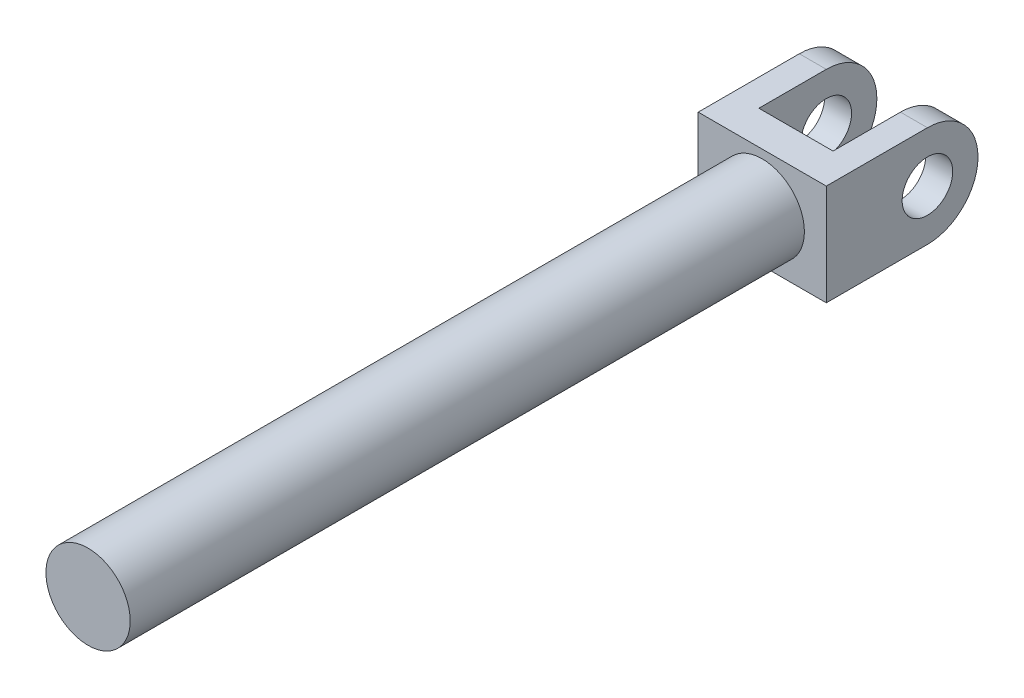
ISO-10303-21;
HEADER;
FILE_DESCRIPTION(('STEP AP214'),'2;1');
FILE_NAME('part.step','',(''),(''),'','','');
FILE_SCHEMA(('AUTOMOTIVE_DESIGN { 1 0 10303 214 1 1 1 1 }'));
ENDSEC;
DATA;
#1=APPLICATION_CONTEXT('core data for automotive mechanical design processes');
#2=APPLICATION_PROTOCOL_DEFINITION('international standard','automotive_design',2000,#1);
#3=PRODUCT_CONTEXT('',#1,'mechanical');
#4=PRODUCT('Part','Part','',(#3));
#5=PRODUCT_RELATED_PRODUCT_CATEGORY('part','',(#4));
#6=PRODUCT_DEFINITION_FORMATION('','',#4);
#7=PRODUCT_DEFINITION_CONTEXT('part definition',#1,'design');
#8=PRODUCT_DEFINITION('design','',#6,#7);
#9=PRODUCT_DEFINITION_SHAPE('','',#8);
#10=(LENGTH_UNIT() NAMED_UNIT(*) SI_UNIT(.MILLI.,.METRE.));
#11=(NAMED_UNIT(*) PLANE_ANGLE_UNIT() SI_UNIT($,.RADIAN.));
#12=(NAMED_UNIT(*) SI_UNIT($,.STERADIAN.) SOLID_ANGLE_UNIT());
#13=UNCERTAINTY_MEASURE_WITH_UNIT(LENGTH_MEASURE(1.E-05),#10,'distance_accuracy_value','');
#14=(GEOMETRIC_REPRESENTATION_CONTEXT(3) GLOBAL_UNCERTAINTY_ASSIGNED_CONTEXT((#13)) GLOBAL_UNIT_ASSIGNED_CONTEXT((#10,
#11,#12)) REPRESENTATION_CONTEXT('',''));
#15=CARTESIAN_POINT('',(0.,0.,0.));
#16=DIRECTION('',(0.,0.,1.));
#17=DIRECTION('',(1.,0.,0.));
#18=AXIS2_PLACEMENT_3D('',#15,#16,#17);
#19=CARTESIAN_POINT('',(19.,0.,0.));
#20=DIRECTION('',(-1.,0.,0.));
#21=DIRECTION('',(0.,0.,1.));
#22=AXIS2_PLACEMENT_3D('',#19,#20,#21);
#23=CYLINDRICAL_SURFACE('',#22,15.);
#24=DIRECTION('',(-1.,0.,0.));
#25=VECTOR('',#24,1.);
#26=CARTESIAN_POINT('',(19.,15.,0.));
#27=LINE('',#26,#25);
#28=CARTESIAN_POINT('',(-11.,15.,0.));
#29=VERTEX_POINT('',#28);
#30=CARTESIAN_POINT('',(-19.,15.,0.));
#31=VERTEX_POINT('',#30);
#32=EDGE_CURVE('E175',#29,#31,#27,.T.);
#33=ORIENTED_EDGE('',*,*,#32,.F.);
#34=CARTESIAN_POINT('',(-11.,0.,0.));
#35=DIRECTION('',(-1.,0.,0.));
#36=DIRECTION('',(0.,0.,1.));
#37=AXIS2_PLACEMENT_3D('',#34,#35,#36);
#38=CIRCLE('',#37,15.);
#39=CARTESIAN_POINT('',(-11.,-15.,0.));
#40=VERTEX_POINT('',#39);
#41=EDGE_CURVE('E144',#29,#40,#38,.T.);
#42=ORIENTED_EDGE('',*,*,#41,.T.);
#43=DIRECTION('',(-1.,0.,0.));
#44=VECTOR('',#43,1.);
#45=CARTESIAN_POINT('',(19.,-15.,0.));
#46=LINE('',#45,#44);
#47=CARTESIAN_POINT('',(-19.,-15.,0.));
#48=VERTEX_POINT('',#47);
#49=EDGE_CURVE('E82',#40,#48,#46,.T.);
#50=ORIENTED_EDGE('',*,*,#49,.T.);
#51=CARTESIAN_POINT('',(-19.,0.,0.));
#52=DIRECTION('',(1.,0.,0.));
#53=DIRECTION('',(0.,0.,-1.));
#54=AXIS2_PLACEMENT_3D('',#51,#52,#53);
#55=CIRCLE('',#54,15.);
#56=EDGE_CURVE('E150',#48,#31,#55,.T.);
#57=ORIENTED_EDGE('',*,*,#56,.T.);
#58=EDGE_LOOP('',(#33,#42,#50,#57));
#59=FACE_BOUND('',#58,.T.);
#60=ADVANCED_FACE('F34',(#59),#23,.T.);
#61=CARTESIAN_POINT('',(19.,0.,0.));
#62=DIRECTION('',(-1.,0.,0.));
#63=DIRECTION('',(0.,0.,1.));
#64=AXIS2_PLACEMENT_3D('',#61,#62,#63);
#65=CYLINDRICAL_SURFACE('',#64,7.5);
#66=CARTESIAN_POINT('',(-11.,0.,0.));
#67=DIRECTION('',(-1.,0.,0.));
#68=DIRECTION('',(0.,0.,1.));
#69=AXIS2_PLACEMENT_3D('',#66,#67,#68);
#70=CIRCLE('',#69,7.5);
#71=CARTESIAN_POINT('',(-11.,0.,7.5));
#72=VERTEX_POINT('',#71);
#73=EDGE_CURVE('E38',#72,#72,#70,.T.);
#74=ORIENTED_EDGE('',*,*,#73,.F.);
#75=EDGE_LOOP('',(#74));
#76=FACE_BOUND('',#75,.T.);
#77=CARTESIAN_POINT('',(-19.,0.,0.));
#78=DIRECTION('',(1.,0.,0.));
#79=DIRECTION('',(0.,0.,-1.));
#80=AXIS2_PLACEMENT_3D('',#77,#78,#79);
#81=CIRCLE('',#80,7.5);
#82=CARTESIAN_POINT('',(-19.,0.,-7.5));
#83=VERTEX_POINT('',#82);
#84=EDGE_CURVE('E146',#83,#83,#81,.T.);
#85=ORIENTED_EDGE('',*,*,#84,.F.);
#86=EDGE_LOOP('',(#85));
#87=FACE_BOUND('',#86,.T.);
#88=ADVANCED_FACE('F185',(#76,#87),#65,.F.);
#89=CARTESIAN_POINT('',(19.,0.,0.));
#90=DIRECTION('',(1.,0.,0.));
#91=DIRECTION('',(0.,0.,-1.));
#92=AXIS2_PLACEMENT_3D('',#89,#90,#91);
#93=PLANE('',#92);
#94=CARTESIAN_POINT('',(19.,0.,0.));
#95=DIRECTION('',(1.,0.,0.));
#96=DIRECTION('',(0.,0.,-1.));
#97=AXIS2_PLACEMENT_3D('',#94,#95,#96);
#98=CIRCLE('',#97,15.);
#99=CARTESIAN_POINT('',(19.,-15.,0.));
#100=VERTEX_POINT('',#99);
#101=CARTESIAN_POINT('',(19.,15.,0.));
#102=VERTEX_POINT('',#101);
#103=EDGE_CURVE('E153',#100,#102,#98,.T.);
#104=ORIENTED_EDGE('',*,*,#103,.T.);
#105=DIRECTION('',(0.,0.,1.));
#106=VECTOR('',#105,1.);
#107=CARTESIAN_POINT('',(19.,15.,30.));
#108=LINE('',#107,#106);
#109=CARTESIAN_POINT('',(19.,15.,30.));
#110=VERTEX_POINT('',#109);
#111=EDGE_CURVE('E90',#102,#110,#108,.T.);
#112=ORIENTED_EDGE('',*,*,#111,.T.);
#113=DIRECTION('',(0.,-1.,0.));
#114=VECTOR('',#113,1.);
#115=CARTESIAN_POINT('',(19.,-15.,30.));
#116=LINE('',#115,#114);
#117=CARTESIAN_POINT('',(19.,-15.,30.));
#118=VERTEX_POINT('',#117);
#119=EDGE_CURVE('E157',#110,#118,#116,.T.);
#120=ORIENTED_EDGE('',*,*,#119,.T.);
#121=DIRECTION('',(0.,0.,-1.));
#122=VECTOR('',#121,1.);
#123=CARTESIAN_POINT('',(19.,-15.,0.));
#124=LINE('',#123,#122);
#125=EDGE_CURVE('E60',#118,#100,#124,.T.);
#126=ORIENTED_EDGE('',*,*,#125,.T.);
#127=EDGE_LOOP('',(#104,#112,#120,#126));
#128=FACE_BOUND('',#127,.T.);
#129=CARTESIAN_POINT('',(19.,0.,0.));
#130=DIRECTION('',(1.,0.,0.));
#131=DIRECTION('',(0.,0.,-1.));
#132=AXIS2_PLACEMENT_3D('',#129,#130,#131);
#133=CIRCLE('',#132,7.5);
#134=CARTESIAN_POINT('',(19.,0.,-7.5));
#135=VERTEX_POINT('',#134);
#136=EDGE_CURVE('E147',#135,#135,#133,.T.);
#137=ORIENTED_EDGE('',*,*,#136,.F.);
#138=EDGE_LOOP('',(#137));
#139=FACE_BOUND('',#138,.T.);
#140=ADVANCED_FACE('F188',(#128,#139),#93,.T.);
#141=CARTESIAN_POINT('',(-19.,0.,0.));
#142=DIRECTION('',(1.,0.,0.));
#143=DIRECTION('',(0.,0.,-1.));
#144=AXIS2_PLACEMENT_3D('',#141,#142,#143);
#145=PLANE('',#144);
#146=ORIENTED_EDGE('',*,*,#56,.F.);
#147=DIRECTION('',(0.,0.,-1.));
#148=VECTOR('',#147,1.);
#149=CARTESIAN_POINT('',(-19.,-15.,0.));
#150=LINE('',#149,#148);
#151=CARTESIAN_POINT('',(-19.,-15.,30.));
#152=VERTEX_POINT('',#151);
#153=EDGE_CURVE('E155',#152,#48,#150,.T.);
#154=ORIENTED_EDGE('',*,*,#153,.F.);
#155=DIRECTION('',(0.,-1.,0.));
#156=VECTOR('',#155,1.);
#157=CARTESIAN_POINT('',(-19.,-15.,30.));
#158=LINE('',#157,#156);
#159=CARTESIAN_POINT('',(-19.,15.,30.));
#160=VERTEX_POINT('',#159);
#161=EDGE_CURVE('E163',#160,#152,#158,.T.);
#162=ORIENTED_EDGE('',*,*,#161,.F.);
#163=DIRECTION('',(0.,0.,1.));
#164=VECTOR('',#163,1.);
#165=CARTESIAN_POINT('',(-19.,15.,30.));
#166=LINE('',#165,#164);
#167=EDGE_CURVE('E161',#31,#160,#166,.T.);
#168=ORIENTED_EDGE('',*,*,#167,.F.);
#169=EDGE_LOOP('',(#146,#154,#162,#168));
#170=FACE_BOUND('',#169,.T.);
#171=ORIENTED_EDGE('',*,*,#84,.T.);
#172=EDGE_LOOP('',(#171));
#173=FACE_BOUND('',#172,.T.);
#174=ADVANCED_FACE('F190',(#170,#173),#145,.F.);
#175=CARTESIAN_POINT('',(11.,0.,0.));
#176=DIRECTION('',(1.,0.,0.));
#177=DIRECTION('',(0.,0.,-1.));
#178=AXIS2_PLACEMENT_3D('',#175,#176,#177);
#179=CIRCLE('',#178,15.);
#180=CARTESIAN_POINT('',(11.,-15.,0.));
#181=VERTEX_POINT('',#180);
#182=CARTESIAN_POINT('',(11.,15.,0.));
#183=VERTEX_POINT('',#182);
#184=EDGE_CURVE('E142',#181,#183,#179,.T.);
#185=ORIENTED_EDGE('',*,*,#184,.T.);
#186=EDGE_CURVE('E43',#102,#183,#27,.T.);
#187=ORIENTED_EDGE('',*,*,#186,.F.);
#188=ORIENTED_EDGE('',*,*,#103,.F.);
#189=EDGE_CURVE('E166',#100,#181,#46,.T.);
#190=ORIENTED_EDGE('',*,*,#189,.T.);
#191=EDGE_LOOP('',(#185,#187,#188,#190));
#192=FACE_BOUND('',#191,.T.);
#193=ADVANCED_FACE('F36',(#192),#23,.T.);
#194=CARTESIAN_POINT('',(19.,15.,30.));
#195=DIRECTION('',(0.,-1.,0.));
#196=DIRECTION('',(0.,0.,-1.));
#197=AXIS2_PLACEMENT_3D('',#194,#195,#196);
#198=PLANE('',#197);
#199=DIRECTION('',(1.,0.,0.));
#200=VECTOR('',#199,1.);
#201=CARTESIAN_POINT('',(-11.,15.,20.));
#202=LINE('',#201,#200);
#203=CARTESIAN_POINT('',(-11.,15.,20.));
#204=VERTEX_POINT('',#203);
#205=CARTESIAN_POINT('',(11.,15.,20.));
#206=VERTEX_POINT('',#205);
#207=EDGE_CURVE('E132',#204,#206,#202,.T.);
#208=ORIENTED_EDGE('',*,*,#207,.F.);
#209=DIRECTION('',(0.,0.,1.));
#210=VECTOR('',#209,1.);
#211=CARTESIAN_POINT('',(-11.,15.,-15.));
#212=LINE('',#211,#210);
#213=EDGE_CURVE('E117',#29,#204,#212,.T.);
#214=ORIENTED_EDGE('',*,*,#213,.F.);
#215=ORIENTED_EDGE('',*,*,#32,.T.);
#216=ORIENTED_EDGE('',*,*,#167,.T.);
#217=DIRECTION('',(-1.,0.,0.));
#218=VECTOR('',#217,1.);
#219=CARTESIAN_POINT('',(19.,15.,30.));
#220=LINE('',#219,#218);
#221=EDGE_CURVE('E172',#110,#160,#220,.T.);
#222=ORIENTED_EDGE('',*,*,#221,.F.);
#223=ORIENTED_EDGE('',*,*,#111,.F.);
#224=ORIENTED_EDGE('',*,*,#186,.T.);
#225=DIRECTION('',(0.,0.,-1.));
#226=VECTOR('',#225,1.);
#227=CARTESIAN_POINT('',(11.,15.,-15.));
#228=LINE('',#227,#226);
#229=EDGE_CURVE('E129',#206,#183,#228,.T.);
#230=ORIENTED_EDGE('',*,*,#229,.F.);
#231=EDGE_LOOP('',(#208,#214,#215,#216,#222,#223,#224,#230));
#232=FACE_BOUND('',#231,.T.);
#233=ADVANCED_FACE('F204',(#232),#198,.F.);
#234=CARTESIAN_POINT('',(19.,-15.,30.));
#235=DIRECTION('',(0.,0.,-1.));
#236=DIRECTION('',(-1.,0.,0.));
#237=AXIS2_PLACEMENT_3D('',#234,#235,#236);
#238=PLANE('',#237);
#239=CARTESIAN_POINT('',(0.,0.,30.));
#240=DIRECTION('',(0.,0.,1.));
#241=DIRECTION('',(1.,0.,0.));
#242=AXIS2_PLACEMENT_3D('',#239,#240,#241);
#243=CIRCLE('',#242,12.5);
#244=CARTESIAN_POINT('',(12.5,0.,30.));
#245=VERTEX_POINT('',#244);
#246=EDGE_CURVE('E11',#245,#245,#243,.T.);
#247=ORIENTED_EDGE('',*,*,#246,.F.);
#248=EDGE_LOOP('',(#247));
#249=FACE_BOUND('',#248,.T.);
#250=ORIENTED_EDGE('',*,*,#161,.T.);
#251=DIRECTION('',(-1.,0.,0.));
#252=VECTOR('',#251,1.);
#253=CARTESIAN_POINT('',(19.,-15.,30.));
#254=LINE('',#253,#252);
#255=EDGE_CURVE('E169',#118,#152,#254,.T.);
#256=ORIENTED_EDGE('',*,*,#255,.F.);
#257=ORIENTED_EDGE('',*,*,#119,.F.);
#258=ORIENTED_EDGE('',*,*,#221,.T.);
#259=EDGE_LOOP('',(#250,#256,#257,#258));
#260=FACE_BOUND('',#259,.T.);
#261=ADVANCED_FACE('F209',(#249,#260),#238,.F.);
#262=CARTESIAN_POINT('',(19.,-15.,0.));
#263=DIRECTION('',(0.,1.,0.));
#264=DIRECTION('',(0.,0.,1.));
#265=AXIS2_PLACEMENT_3D('',#262,#263,#264);
#266=PLANE('',#265);
#267=ORIENTED_EDGE('',*,*,#49,.F.);
#268=DIRECTION('',(0.,0.,1.));
#269=VECTOR('',#268,1.);
#270=CARTESIAN_POINT('',(-11.,-15.,-15.));
#271=LINE('',#270,#269);
#272=CARTESIAN_POINT('',(-11.,-15.,20.));
#273=VERTEX_POINT('',#272);
#274=EDGE_CURVE('E115',#40,#273,#271,.T.);
#275=ORIENTED_EDGE('',*,*,#274,.T.);
#276=DIRECTION('',(1.,0.,0.));
#277=VECTOR('',#276,1.);
#278=CARTESIAN_POINT('',(-11.,-15.,20.));
#279=LINE('',#278,#277);
#280=CARTESIAN_POINT('',(11.,-15.,20.));
#281=VERTEX_POINT('',#280);
#282=EDGE_CURVE('E124',#273,#281,#279,.T.);
#283=ORIENTED_EDGE('',*,*,#282,.T.);
#284=DIRECTION('',(0.,0.,-1.));
#285=VECTOR('',#284,1.);
#286=CARTESIAN_POINT('',(11.,-15.,-15.));
#287=LINE('',#286,#285);
#288=EDGE_CURVE('E51',#281,#181,#287,.T.);
#289=ORIENTED_EDGE('',*,*,#288,.T.);
#290=ORIENTED_EDGE('',*,*,#189,.F.);
#291=ORIENTED_EDGE('',*,*,#125,.F.);
#292=ORIENTED_EDGE('',*,*,#255,.T.);
#293=ORIENTED_EDGE('',*,*,#153,.T.);
#294=EDGE_LOOP('',(#267,#275,#283,#289,#290,#291,#292,#293));
#295=FACE_BOUND('',#294,.T.);
#296=ADVANCED_FACE('F128',(#295),#266,.F.);
#297=CARTESIAN_POINT('',(11.,0.,0.));
#298=DIRECTION('',(1.,0.,0.));
#299=DIRECTION('',(0.,0.,-1.));
#300=AXIS2_PLACEMENT_3D('',#297,#298,#299);
#301=CIRCLE('',#300,7.5);
#302=CARTESIAN_POINT('',(11.,0.,-7.5));
#303=VERTEX_POINT('',#302);
#304=EDGE_CURVE('E140',#303,#303,#301,.T.);
#305=ORIENTED_EDGE('',*,*,#304,.F.);
#306=EDGE_LOOP('',(#305));
#307=FACE_BOUND('',#306,.T.);
#308=ORIENTED_EDGE('',*,*,#136,.T.);
#309=EDGE_LOOP('',(#308));
#310=FACE_BOUND('',#309,.T.);
#311=ADVANCED_FACE('F181',(#307,#310),#65,.F.);
#312=CARTESIAN_POINT('',(-11.,-15.,-15.));
#313=DIRECTION('',(-1.,0.,0.));
#314=DIRECTION('',(0.,0.,1.));
#315=AXIS2_PLACEMENT_3D('',#312,#313,#314);
#316=PLANE('',#315);
#317=ORIENTED_EDGE('',*,*,#73,.T.);
#318=EDGE_LOOP('',(#317));
#319=FACE_BOUND('',#318,.T.);
#320=ORIENTED_EDGE('',*,*,#213,.T.);
#321=DIRECTION('',(0.,1.,0.));
#322=VECTOR('',#321,1.);
#323=CARTESIAN_POINT('',(-11.,-15.,20.));
#324=LINE('',#323,#322);
#325=EDGE_CURVE('E111',#273,#204,#324,.T.);
#326=ORIENTED_EDGE('',*,*,#325,.F.);
#327=ORIENTED_EDGE('',*,*,#274,.F.);
#328=ORIENTED_EDGE('',*,*,#41,.F.);
#329=EDGE_LOOP('',(#320,#326,#327,#328));
#330=FACE_BOUND('',#329,.T.);
#331=ADVANCED_FACE('F113',(#319,#330),#316,.F.);
#332=CARTESIAN_POINT('',(11.,-15.,-15.));
#333=DIRECTION('',(1.,0.,0.));
#334=DIRECTION('',(0.,0.,-1.));
#335=AXIS2_PLACEMENT_3D('',#332,#333,#334);
#336=PLANE('',#335);
#337=ORIENTED_EDGE('',*,*,#304,.T.);
#338=EDGE_LOOP('',(#337));
#339=FACE_BOUND('',#338,.T.);
#340=ORIENTED_EDGE('',*,*,#184,.F.);
#341=ORIENTED_EDGE('',*,*,#288,.F.);
#342=DIRECTION('',(0.,1.,0.));
#343=VECTOR('',#342,1.);
#344=CARTESIAN_POINT('',(11.,-15.,20.));
#345=LINE('',#344,#343);
#346=EDGE_CURVE('E121',#281,#206,#345,.T.);
#347=ORIENTED_EDGE('',*,*,#346,.T.);
#348=ORIENTED_EDGE('',*,*,#229,.T.);
#349=EDGE_LOOP('',(#340,#341,#347,#348));
#350=FACE_BOUND('',#349,.T.);
#351=ADVANCED_FACE('F179',(#339,#350),#336,.F.);
#352=CARTESIAN_POINT('',(-11.,-15.,20.));
#353=DIRECTION('',(0.,0.,1.));
#354=DIRECTION('',(1.,0.,0.));
#355=AXIS2_PLACEMENT_3D('',#352,#353,#354);
#356=PLANE('',#355);
#357=ORIENTED_EDGE('',*,*,#207,.T.);
#358=ORIENTED_EDGE('',*,*,#346,.F.);
#359=ORIENTED_EDGE('',*,*,#282,.F.);
#360=ORIENTED_EDGE('',*,*,#325,.T.);
#361=EDGE_LOOP('',(#357,#358,#359,#360));
#362=FACE_BOUND('',#361,.T.);
#363=ADVANCED_FACE('F125',(#362),#356,.F.);
#364=CARTESIAN_POINT('',(0.,0.,230.));
#365=DIRECTION('',(0.,0.,-1.));
#366=DIRECTION('',(-1.,0.,0.));
#367=AXIS2_PLACEMENT_3D('',#364,#365,#366);
#368=CYLINDRICAL_SURFACE('',#367,12.5);
#369=CARTESIAN_POINT('',(0.,0.,230.));
#370=DIRECTION('',(0.,0.,1.));
#371=DIRECTION('',(1.,0.,0.));
#372=AXIS2_PLACEMENT_3D('',#369,#370,#371);
#373=CIRCLE('',#372,12.5);
#374=CARTESIAN_POINT('',(12.5,0.,230.));
#375=VERTEX_POINT('',#374);
#376=EDGE_CURVE('E138',#375,#375,#373,.T.);
#377=ORIENTED_EDGE('',*,*,#376,.F.);
#378=EDGE_LOOP('',(#377));
#379=FACE_BOUND('',#378,.T.);
#380=ORIENTED_EDGE('',*,*,#246,.T.);
#381=EDGE_LOOP('',(#380));
#382=FACE_BOUND('',#381,.T.);
#383=ADVANCED_FACE('F230',(#379,#382),#368,.T.);
#384=CARTESIAN_POINT('',(0.,0.,230.));
#385=DIRECTION('',(0.,0.,1.));
#386=DIRECTION('',(1.,0.,0.));
#387=AXIS2_PLACEMENT_3D('',#384,#385,#386);
#388=PLANE('',#387);
#389=ORIENTED_EDGE('',*,*,#376,.T.);
#390=EDGE_LOOP('',(#389));
#391=FACE_BOUND('',#390,.T.);
#392=ADVANCED_FACE('F232',(#391),#388,.T.);
#393=CLOSED_SHELL('',(#60,#88,#140,#174,#193,#233,#261,#296,#311,#331,#351,#363,#383,#392));
#394=MANIFOLD_SOLID_BREP('B2',#393);
#395=ADVANCED_BREP_SHAPE_REPRESENTATION('',(#18,#394),#14);
#396=SHAPE_DEFINITION_REPRESENTATION(#9,#395);
ENDSEC;
END-ISO-10303-21;
